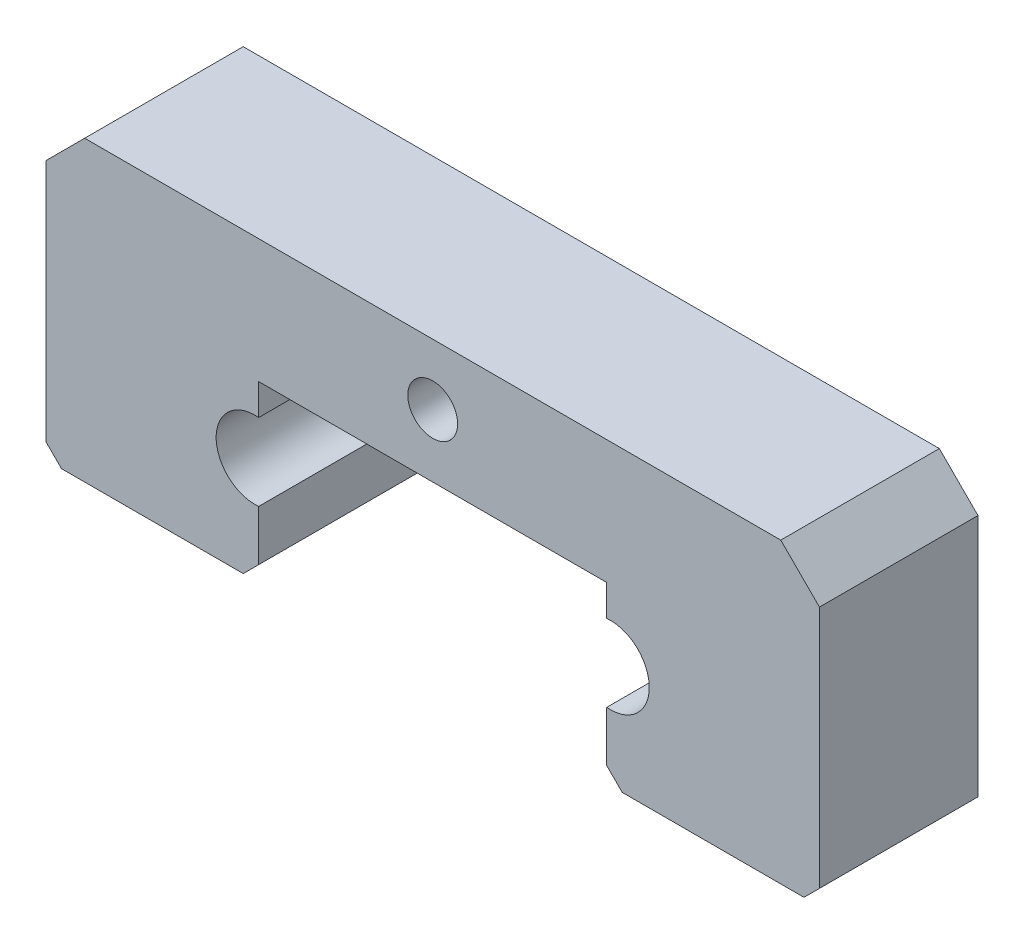
ISO-10303-21;
HEADER;
FILE_DESCRIPTION(('STEP AP214'),'2;1');
FILE_NAME('part.step','',(''),(''),'','','');
FILE_SCHEMA(('AUTOMOTIVE_DESIGN { 1 0 10303 214 1 1 1 1 }'));
ENDSEC;
DATA;
#1=APPLICATION_CONTEXT('core data for automotive mechanical design processes');
#2=APPLICATION_PROTOCOL_DEFINITION('international standard','automotive_design',2000,#1);
#3=PRODUCT_CONTEXT('',#1,'mechanical');
#4=PRODUCT('Part','Part','',(#3));
#5=PRODUCT_RELATED_PRODUCT_CATEGORY('part','',(#4));
#6=PRODUCT_DEFINITION_FORMATION('','',#4);
#7=PRODUCT_DEFINITION_CONTEXT('part definition',#1,'design');
#8=PRODUCT_DEFINITION('design','',#6,#7);
#9=PRODUCT_DEFINITION_SHAPE('','',#8);
#10=(LENGTH_UNIT() NAMED_UNIT(*) SI_UNIT(.MILLI.,.METRE.));
#11=(NAMED_UNIT(*) PLANE_ANGLE_UNIT() SI_UNIT($,.RADIAN.));
#12=(NAMED_UNIT(*) SI_UNIT($,.STERADIAN.) SOLID_ANGLE_UNIT());
#13=UNCERTAINTY_MEASURE_WITH_UNIT(LENGTH_MEASURE(1.E-05),#10,'distance_accuracy_value','');
#14=(GEOMETRIC_REPRESENTATION_CONTEXT(3) GLOBAL_UNCERTAINTY_ASSIGNED_CONTEXT((#13)) GLOBAL_UNIT_ASSIGNED_CONTEXT((#10,
#11,#12)) REPRESENTATION_CONTEXT('',''));
#15=CARTESIAN_POINT('',(0.,0.,0.));
#16=DIRECTION('',(0.,0.,1.));
#17=DIRECTION('',(1.,0.,0.));
#18=AXIS2_PLACEMENT_3D('',#15,#16,#17);
#19=CARTESIAN_POINT('',(10.,-3.6,19.05));
#20=DIRECTION('',(-0.707106781186548,0.707106781186548,0.));
#21=DIRECTION('',(0.,0.,1.));
#22=AXIS2_PLACEMENT_3D('',#19,#20,#21);
#23=PLANE('',#22);
#24=DIRECTION('',(0.707106781186548,0.707106781186548,0.));
#25=VECTOR('',#24,1.);
#26=CARTESIAN_POINT('',(9.6,-4.,19.05));
#27=LINE('',#26,#25);
#28=CARTESIAN_POINT('',(9.6,-4.,19.05));
#29=VERTEX_POINT('',#28);
#30=CARTESIAN_POINT('',(10.,-3.6,19.05));
#31=VERTEX_POINT('',#30);
#32=EDGE_CURVE('E317',#29,#31,#27,.T.);
#33=ORIENTED_EDGE('',*,*,#32,.F.);
#34=DIRECTION('',(0.,0.,1.));
#35=VECTOR('',#34,1.);
#36=CARTESIAN_POINT('',(9.6,-4.,14.95));
#37=LINE('',#36,#35);
#38=CARTESIAN_POINT('',(9.6,-4.,14.95));
#39=VERTEX_POINT('',#38);
#40=EDGE_CURVE('E247',#39,#29,#37,.T.);
#41=ORIENTED_EDGE('',*,*,#40,.F.);
#42=DIRECTION('',(-0.707106781186547,-0.707106781186548,0.));
#43=VECTOR('',#42,1.);
#44=CARTESIAN_POINT('',(10.,-3.6,14.95));
#45=LINE('',#44,#43);
#46=CARTESIAN_POINT('',(10.,-3.6,14.95));
#47=VERTEX_POINT('',#46);
#48=EDGE_CURVE('E261',#47,#39,#45,.T.);
#49=ORIENTED_EDGE('',*,*,#48,.F.);
#50=DIRECTION('',(0.,0.,-1.));
#51=VECTOR('',#50,1.);
#52=CARTESIAN_POINT('',(10.,-3.6,19.05));
#53=LINE('',#52,#51);
#54=EDGE_CURVE('E296',#31,#47,#53,.T.);
#55=ORIENTED_EDGE('',*,*,#54,.F.);
#56=EDGE_LOOP('',(#33,#41,#49,#55));
#57=FACE_BOUND('',#56,.T.);
#58=ADVANCED_FACE('F17',(#57),#23,.F.);
#59=CARTESIAN_POINT('',(4.9,-4.,19.05));
#60=DIRECTION('',(-0.707106781186548,-0.707106781186548,0.));
#61=DIRECTION('',(-0.707106781186548,0.707106781186548,0.));
#62=AXIS2_PLACEMENT_3D('',#59,#60,#61);
#63=PLANE('',#62);
#64=DIRECTION('',(0.707106781186547,-0.707106781186548,0.));
#65=VECTOR('',#64,1.);
#66=CARTESIAN_POINT('',(4.5,-3.6,19.05));
#67=LINE('',#66,#65);
#68=CARTESIAN_POINT('',(4.5,-3.6,19.05));
#69=VERTEX_POINT('',#68);
#70=CARTESIAN_POINT('',(4.9,-4.,19.05));
#71=VERTEX_POINT('',#70);
#72=EDGE_CURVE('E313',#69,#71,#67,.T.);
#73=ORIENTED_EDGE('',*,*,#72,.F.);
#74=DIRECTION('',(0.,0.,1.));
#75=VECTOR('',#74,1.);
#76=CARTESIAN_POINT('',(4.5,-3.6,14.95));
#77=LINE('',#76,#75);
#78=CARTESIAN_POINT('',(4.5,-3.6,14.95));
#79=VERTEX_POINT('',#78);
#80=EDGE_CURVE('E236',#79,#69,#77,.T.);
#81=ORIENTED_EDGE('',*,*,#80,.F.);
#82=DIRECTION('',(-0.707106781186548,0.707106781186548,0.));
#83=VECTOR('',#82,1.);
#84=CARTESIAN_POINT('',(4.9,-4.,14.95));
#85=LINE('',#84,#83);
#86=CARTESIAN_POINT('',(4.9,-4.,14.95));
#87=VERTEX_POINT('',#86);
#88=EDGE_CURVE('E28',#87,#79,#85,.T.);
#89=ORIENTED_EDGE('',*,*,#88,.F.);
#90=DIRECTION('',(0.,0.,-1.));
#91=VECTOR('',#90,1.);
#92=CARTESIAN_POINT('',(4.9,-4.,19.05));
#93=LINE('',#92,#91);
#94=EDGE_CURVE('E287',#71,#87,#93,.T.);
#95=ORIENTED_EDGE('',*,*,#94,.F.);
#96=EDGE_LOOP('',(#73,#81,#89,#95));
#97=FACE_BOUND('',#96,.T.);
#98=ADVANCED_FACE('F427',(#97),#63,.T.);
#99=CARTESIAN_POINT('',(-4.5,-3.6,19.05));
#100=DIRECTION('',(-0.707106781186548,0.707106781186548,0.));
#101=DIRECTION('',(0.,0.,1.));
#102=AXIS2_PLACEMENT_3D('',#99,#100,#101);
#103=PLANE('',#102);
#104=DIRECTION('',(0.707106781186547,0.707106781186548,0.));
#105=VECTOR('',#104,1.);
#106=CARTESIAN_POINT('',(-4.9,-4.,19.05));
#107=LINE('',#106,#105);
#108=CARTESIAN_POINT('',(-4.9,-4.,19.05));
#109=VERTEX_POINT('',#108);
#110=CARTESIAN_POINT('',(-4.5,-3.6,19.05));
#111=VERTEX_POINT('',#110);
#112=EDGE_CURVE('E294',#109,#111,#107,.T.);
#113=ORIENTED_EDGE('',*,*,#112,.F.);
#114=DIRECTION('',(0.,0.,1.));
#115=VECTOR('',#114,1.);
#116=CARTESIAN_POINT('',(-4.9,-4.,14.95));
#117=LINE('',#116,#115);
#118=CARTESIAN_POINT('',(-4.9,-4.,14.95));
#119=VERTEX_POINT('',#118);
#120=EDGE_CURVE('E233',#119,#109,#117,.T.);
#121=ORIENTED_EDGE('',*,*,#120,.F.);
#122=DIRECTION('',(-0.707106781186548,-0.707106781186548,0.));
#123=VECTOR('',#122,1.);
#124=CARTESIAN_POINT('',(-4.5,-3.6,14.95));
#125=LINE('',#124,#123);
#126=CARTESIAN_POINT('',(-4.5,-3.6,14.95));
#127=VERTEX_POINT('',#126);
#128=EDGE_CURVE('E11',#127,#119,#125,.T.);
#129=ORIENTED_EDGE('',*,*,#128,.F.);
#130=DIRECTION('',(0.,0.,-1.));
#131=VECTOR('',#130,1.);
#132=CARTESIAN_POINT('',(-4.5,-3.6,19.05));
#133=LINE('',#132,#131);
#134=EDGE_CURVE('E232',#111,#127,#133,.T.);
#135=ORIENTED_EDGE('',*,*,#134,.F.);
#136=EDGE_LOOP('',(#113,#121,#129,#135));
#137=FACE_BOUND('',#136,.T.);
#138=ADVANCED_FACE('F394',(#137),#103,.F.);
#139=CARTESIAN_POINT('',(-9.6,-4.,19.05));
#140=DIRECTION('',(-0.707106781186548,-0.707106781186548,0.));
#141=DIRECTION('',(-0.707106781186548,0.707106781186548,0.));
#142=AXIS2_PLACEMENT_3D('',#139,#140,#141);
#143=PLANE('',#142);
#144=DIRECTION('',(0.707106781186548,-0.707106781186548,0.));
#145=VECTOR('',#144,1.);
#146=CARTESIAN_POINT('',(-10.,-3.6,19.05));
#147=LINE('',#146,#145);
#148=CARTESIAN_POINT('',(-10.,-3.6,19.05));
#149=VERTEX_POINT('',#148);
#150=CARTESIAN_POINT('',(-9.6,-4.,19.05));
#151=VERTEX_POINT('',#150);
#152=EDGE_CURVE('E162',#149,#151,#147,.T.);
#153=ORIENTED_EDGE('',*,*,#152,.F.);
#154=DIRECTION('',(0.,0.,1.));
#155=VECTOR('',#154,1.);
#156=CARTESIAN_POINT('',(-10.,-3.6,14.95));
#157=LINE('',#156,#155);
#158=CARTESIAN_POINT('',(-10.,-3.6,14.95));
#159=VERTEX_POINT('',#158);
#160=EDGE_CURVE('E257',#159,#149,#157,.T.);
#161=ORIENTED_EDGE('',*,*,#160,.F.);
#162=DIRECTION('',(-0.707106781186547,0.707106781186549,0.));
#163=VECTOR('',#162,1.);
#164=CARTESIAN_POINT('',(-9.6,-4.,14.95));
#165=LINE('',#164,#163);
#166=CARTESIAN_POINT('',(-9.6,-4.,14.95));
#167=VERTEX_POINT('',#166);
#168=EDGE_CURVE('E266',#167,#159,#165,.T.);
#169=ORIENTED_EDGE('',*,*,#168,.F.);
#170=DIRECTION('',(0.,0.,-1.));
#171=VECTOR('',#170,1.);
#172=CARTESIAN_POINT('',(-9.6,-4.,19.05));
#173=LINE('',#172,#171);
#174=EDGE_CURVE('E244',#151,#167,#173,.T.);
#175=ORIENTED_EDGE('',*,*,#174,.F.);
#176=EDGE_LOOP('',(#153,#161,#169,#175));
#177=FACE_BOUND('',#176,.T.);
#178=ADVANCED_FACE('F19',(#177),#143,.T.);
#179=CARTESIAN_POINT('',(9.,3.7,19.05));
#180=DIRECTION('',(0.707106781186548,0.707106781186548,0.));
#181=DIRECTION('',(0.,0.,-1.));
#182=AXIS2_PLACEMENT_3D('',#179,#180,#181);
#183=PLANE('',#182);
#184=DIRECTION('',(-0.707106781186548,0.707106781186547,0.));
#185=VECTOR('',#184,1.);
#186=CARTESIAN_POINT('',(10.,2.7,19.05));
#187=LINE('',#186,#185);
#188=CARTESIAN_POINT('',(10.,2.7,19.05));
#189=VERTEX_POINT('',#188);
#190=CARTESIAN_POINT('',(9.,3.7,19.05));
#191=VERTEX_POINT('',#190);
#192=EDGE_CURVE('E374',#189,#191,#187,.T.);
#193=ORIENTED_EDGE('',*,*,#192,.F.);
#194=DIRECTION('',(0.,0.,1.));
#195=VECTOR('',#194,1.);
#196=CARTESIAN_POINT('',(10.,2.7,14.95));
#197=LINE('',#196,#195);
#198=CARTESIAN_POINT('',(10.,2.7,14.95));
#199=VERTEX_POINT('',#198);
#200=EDGE_CURVE('E345',#199,#189,#197,.T.);
#201=ORIENTED_EDGE('',*,*,#200,.F.);
#202=DIRECTION('',(0.707106781186548,-0.707106781186547,0.));
#203=VECTOR('',#202,1.);
#204=CARTESIAN_POINT('',(9.,3.7,14.95));
#205=LINE('',#204,#203);
#206=CARTESIAN_POINT('',(9.,3.7,14.95));
#207=VERTEX_POINT('',#206);
#208=EDGE_CURVE('E258',#207,#199,#205,.T.);
#209=ORIENTED_EDGE('',*,*,#208,.F.);
#210=DIRECTION('',(0.,0.,-1.));
#211=VECTOR('',#210,1.);
#212=CARTESIAN_POINT('',(9.,3.7,19.05));
#213=LINE('',#212,#211);
#214=EDGE_CURVE('E292',#191,#207,#213,.T.);
#215=ORIENTED_EDGE('',*,*,#214,.F.);
#216=EDGE_LOOP('',(#193,#201,#209,#215));
#217=FACE_BOUND('',#216,.T.);
#218=ADVANCED_FACE('F449',(#217),#183,.T.);
#219=CARTESIAN_POINT('',(-10.,2.7,19.05));
#220=DIRECTION('',(0.707106781186546,-0.707106781186549,0.));
#221=DIRECTION('',(0.,0.,-1.));
#222=AXIS2_PLACEMENT_3D('',#219,#220,#221);
#223=PLANE('',#222);
#224=DIRECTION('',(-0.707106781186549,-0.707106781186546,0.));
#225=VECTOR('',#224,1.);
#226=CARTESIAN_POINT('',(-9.,3.7,19.05));
#227=LINE('',#226,#225);
#228=CARTESIAN_POINT('',(-9.,3.7,19.05));
#229=VERTEX_POINT('',#228);
#230=CARTESIAN_POINT('',(-10.,2.7,19.05));
#231=VERTEX_POINT('',#230);
#232=EDGE_CURVE('E21',#229,#231,#227,.T.);
#233=ORIENTED_EDGE('',*,*,#232,.F.);
#234=DIRECTION('',(0.,0.,1.));
#235=VECTOR('',#234,1.);
#236=CARTESIAN_POINT('',(-9.,3.7,14.95));
#237=LINE('',#236,#235);
#238=CARTESIAN_POINT('',(-9.,3.7,14.95));
#239=VERTEX_POINT('',#238);
#240=EDGE_CURVE('E279',#239,#229,#237,.T.);
#241=ORIENTED_EDGE('',*,*,#240,.F.);
#242=DIRECTION('',(0.707106781186549,0.707106781186546,0.));
#243=VECTOR('',#242,1.);
#244=CARTESIAN_POINT('',(-10.,2.7,14.95));
#245=LINE('',#244,#243);
#246=CARTESIAN_POINT('',(-10.,2.7,14.95));
#247=VERTEX_POINT('',#246);
#248=EDGE_CURVE('E262',#247,#239,#245,.T.);
#249=ORIENTED_EDGE('',*,*,#248,.F.);
#250=DIRECTION('',(0.,0.,-1.));
#251=VECTOR('',#250,1.);
#252=CARTESIAN_POINT('',(-10.,2.7,19.05));
#253=LINE('',#252,#251);
#254=EDGE_CURVE('E245',#231,#247,#253,.T.);
#255=ORIENTED_EDGE('',*,*,#254,.F.);
#256=EDGE_LOOP('',(#233,#241,#249,#255));
#257=FACE_BOUND('',#256,.T.);
#258=ADVANCED_FACE('F655',(#257),#223,.F.);
#259=CARTESIAN_POINT('',(0.,0.,14.95));
#260=DIRECTION('',(0.,0.,1.));
#261=DIRECTION('',(1.,0.,0.));
#262=AXIS2_PLACEMENT_3D('',#259,#260,#261);
#263=PLANE('',#262);
#264=CARTESIAN_POINT('',(0.,2.12300290726788,14.95));
#265=DIRECTION('',(0.,0.,1.));
#266=DIRECTION('',(1.,0.,0.));
#267=AXIS2_PLACEMENT_3D('',#264,#265,#266);
#268=CIRCLE('',#267,0.644009461630724);
#269=CARTESIAN_POINT('',(0.644009461630724,2.12300290726788,14.95));
#270=VERTEX_POINT('',#269);
#271=EDGE_CURVE('E94',#270,#270,#268,.T.);
#272=ORIENTED_EDGE('',*,*,#271,.T.);
#273=EDGE_LOOP('',(#272));
#274=FACE_BOUND('',#273,.T.);
#275=DIRECTION('',(1.,0.,0.));
#276=VECTOR('',#275,1.);
#277=CARTESIAN_POINT('',(-9.6,-4.,14.95));
#278=LINE('',#277,#276);
#279=EDGE_CURVE('E331',#167,#119,#278,.T.);
#280=ORIENTED_EDGE('',*,*,#279,.F.);
#281=ORIENTED_EDGE('',*,*,#168,.T.);
#282=DIRECTION('',(0.,1.,0.));
#283=VECTOR('',#282,1.);
#284=CARTESIAN_POINT('',(-10.,-3.6,14.95));
#285=LINE('',#284,#283);
#286=EDGE_CURVE('E288',#159,#247,#285,.T.);
#287=ORIENTED_EDGE('',*,*,#286,.T.);
#288=ORIENTED_EDGE('',*,*,#248,.T.);
#289=DIRECTION('',(1.,0.,0.));
#290=VECTOR('',#289,1.);
#291=CARTESIAN_POINT('',(-9.,3.7,14.95));
#292=LINE('',#291,#290);
#293=EDGE_CURVE('E283',#239,#207,#292,.T.);
#294=ORIENTED_EDGE('',*,*,#293,.T.);
#295=ORIENTED_EDGE('',*,*,#208,.T.);
#296=DIRECTION('',(0.,1.,0.));
#297=VECTOR('',#296,1.);
#298=CARTESIAN_POINT('',(10.,-3.6,14.95));
#299=LINE('',#298,#297);
#300=EDGE_CURVE('E299',#47,#199,#299,.T.);
#301=ORIENTED_EDGE('',*,*,#300,.F.);
#302=ORIENTED_EDGE('',*,*,#48,.T.);
#303=DIRECTION('',(1.,0.,0.));
#304=VECTOR('',#303,1.);
#305=CARTESIAN_POINT('',(4.9,-4.,14.95));
#306=LINE('',#305,#304);
#307=EDGE_CURVE('E252',#87,#39,#306,.T.);
#308=ORIENTED_EDGE('',*,*,#307,.F.);
#309=ORIENTED_EDGE('',*,*,#88,.T.);
#310=DIRECTION('',(0.,1.,0.));
#311=VECTOR('',#310,1.);
#312=CARTESIAN_POINT('',(4.5,-3.6,14.95));
#313=LINE('',#312,#311);
#314=CARTESIAN_POINT('',(4.5,-2.29498743710662,14.95));
#315=VERTEX_POINT('',#314);
#316=EDGE_CURVE('E241',#79,#315,#313,.T.);
#317=ORIENTED_EDGE('',*,*,#316,.T.);
#318=CARTESIAN_POINT('',(4.6,-1.3,14.95));
#319=DIRECTION('',(0.,0.,1.));
#320=DIRECTION('',(1.,0.,0.));
#321=AXIS2_PLACEMENT_3D('',#318,#319,#320);
#322=CIRCLE('',#321,1.);
#323=CARTESIAN_POINT('',(4.5,-0.305012562893379,14.95));
#324=VERTEX_POINT('',#323);
#325=EDGE_CURVE('E211',#315,#324,#322,.T.);
#326=ORIENTED_EDGE('',*,*,#325,.T.);
#327=DIRECTION('',(0.,1.,0.));
#328=VECTOR('',#327,1.);
#329=CARTESIAN_POINT('',(4.5,-0.305012562893379,14.95));
#330=LINE('',#329,#328);
#331=CARTESIAN_POINT('',(4.5,0.5,14.95));
#332=VERTEX_POINT('',#331);
#333=EDGE_CURVE('E271',#324,#332,#330,.T.);
#334=ORIENTED_EDGE('',*,*,#333,.T.);
#335=DIRECTION('',(1.,0.,0.));
#336=VECTOR('',#335,1.);
#337=CARTESIAN_POINT('',(-4.5,0.5,14.95));
#338=LINE('',#337,#336);
#339=CARTESIAN_POINT('',(-4.5,0.5,14.95));
#340=VERTEX_POINT('',#339);
#341=EDGE_CURVE('E194',#340,#332,#338,.T.);
#342=ORIENTED_EDGE('',*,*,#341,.F.);
#343=DIRECTION('',(0.,1.,0.));
#344=VECTOR('',#343,1.);
#345=CARTESIAN_POINT('',(-4.5,-0.30501256289338,14.95));
#346=LINE('',#345,#344);
#347=CARTESIAN_POINT('',(-4.5,-0.30501256289338,14.95));
#348=VERTEX_POINT('',#347);
#349=EDGE_CURVE('E185',#348,#340,#346,.T.);
#350=ORIENTED_EDGE('',*,*,#349,.F.);
#351=CARTESIAN_POINT('',(-4.6,-1.3,14.95));
#352=DIRECTION('',(0.,0.,1.));
#353=DIRECTION('',(1.,0.,0.));
#354=AXIS2_PLACEMENT_3D('',#351,#352,#353);
#355=CIRCLE('',#354,1.);
#356=CARTESIAN_POINT('',(-4.5,-2.29498743710662,14.95));
#357=VERTEX_POINT('',#356);
#358=EDGE_CURVE('E191',#348,#357,#355,.T.);
#359=ORIENTED_EDGE('',*,*,#358,.T.);
#360=DIRECTION('',(0.,1.,0.));
#361=VECTOR('',#360,1.);
#362=CARTESIAN_POINT('',(-4.5,-3.6,14.95));
#363=LINE('',#362,#361);
#364=EDGE_CURVE('E200',#127,#357,#363,.T.);
#365=ORIENTED_EDGE('',*,*,#364,.F.);
#366=ORIENTED_EDGE('',*,*,#128,.T.);
#367=EDGE_LOOP('',(#280,#281,#287,#288,#294,#295,#301,#302,#308,#309,#317,#326,#334,#342,#350,
#359,#365,#366));
#368=FACE_BOUND('',#367,.T.);
#369=ADVANCED_FACE('F188',(#274,#368),#263,.F.);
#370=CARTESIAN_POINT('',(0.,0.,19.05));
#371=DIRECTION('',(0.,0.,1.));
#372=DIRECTION('',(1.,0.,0.));
#373=AXIS2_PLACEMENT_3D('',#370,#371,#372);
#374=PLANE('',#373);
#375=CARTESIAN_POINT('',(0.,2.12300290726788,19.05));
#376=DIRECTION('',(0.,0.,1.));
#377=DIRECTION('',(1.,0.,0.));
#378=AXIS2_PLACEMENT_3D('',#375,#376,#377);
#379=CIRCLE('',#378,0.644009461630724);
#380=CARTESIAN_POINT('',(0.644009461630724,2.12300290726788,19.05));
#381=VERTEX_POINT('',#380);
#382=EDGE_CURVE('E326',#381,#381,#379,.T.);
#383=ORIENTED_EDGE('',*,*,#382,.F.);
#384=EDGE_LOOP('',(#383));
#385=FACE_BOUND('',#384,.T.);
#386=DIRECTION('',(0.,1.,0.));
#387=VECTOR('',#386,1.);
#388=CARTESIAN_POINT('',(-10.,-3.6,19.05));
#389=LINE('',#388,#387);
#390=EDGE_CURVE('E253',#149,#231,#389,.T.);
#391=ORIENTED_EDGE('',*,*,#390,.F.);
#392=ORIENTED_EDGE('',*,*,#152,.T.);
#393=DIRECTION('',(1.,0.,0.));
#394=VECTOR('',#393,1.);
#395=CARTESIAN_POINT('',(-9.6,-4.,19.05));
#396=LINE('',#395,#394);
#397=EDGE_CURVE('E242',#151,#109,#396,.T.);
#398=ORIENTED_EDGE('',*,*,#397,.T.);
#399=ORIENTED_EDGE('',*,*,#112,.T.);
#400=DIRECTION('',(0.,1.,0.));
#401=VECTOR('',#400,1.);
#402=CARTESIAN_POINT('',(-4.5,-3.6,19.05));
#403=LINE('',#402,#401);
#404=CARTESIAN_POINT('',(-4.5,-2.29498743710662,19.05));
#405=VERTEX_POINT('',#404);
#406=EDGE_CURVE('E228',#111,#405,#403,.T.);
#407=ORIENTED_EDGE('',*,*,#406,.T.);
#408=CARTESIAN_POINT('',(-4.6,-1.3,19.05));
#409=DIRECTION('',(0.,0.,1.));
#410=DIRECTION('',(1.,0.,0.));
#411=AXIS2_PLACEMENT_3D('',#408,#409,#410);
#412=CIRCLE('',#411,1.);
#413=CARTESIAN_POINT('',(-4.5,-0.30501256289338,19.05));
#414=VERTEX_POINT('',#413);
#415=EDGE_CURVE('E222',#414,#405,#412,.T.);
#416=ORIENTED_EDGE('',*,*,#415,.F.);
#417=DIRECTION('',(0.,1.,0.));
#418=VECTOR('',#417,1.);
#419=CARTESIAN_POINT('',(-4.5,-0.30501256289338,19.05));
#420=LINE('',#419,#418);
#421=CARTESIAN_POINT('',(-4.5,0.5,19.05));
#422=VERTEX_POINT('',#421);
#423=EDGE_CURVE('E206',#414,#422,#420,.T.);
#424=ORIENTED_EDGE('',*,*,#423,.T.);
#425=DIRECTION('',(1.,0.,0.));
#426=VECTOR('',#425,1.);
#427=CARTESIAN_POINT('',(-4.5,0.5,19.05));
#428=LINE('',#427,#426);
#429=CARTESIAN_POINT('',(4.5,0.5,19.05));
#430=VERTEX_POINT('',#429);
#431=EDGE_CURVE('E270',#422,#430,#428,.T.);
#432=ORIENTED_EDGE('',*,*,#431,.T.);
#433=DIRECTION('',(0.,1.,0.));
#434=VECTOR('',#433,1.);
#435=CARTESIAN_POINT('',(4.5,-0.305012562893379,19.05));
#436=LINE('',#435,#434);
#437=CARTESIAN_POINT('',(4.5,-0.305012562893379,19.05));
#438=VERTEX_POINT('',#437);
#439=EDGE_CURVE('E42',#438,#430,#436,.T.);
#440=ORIENTED_EDGE('',*,*,#439,.F.);
#441=CARTESIAN_POINT('',(4.6,-1.3,19.05));
#442=DIRECTION('',(0.,0.,1.));
#443=DIRECTION('',(1.,0.,0.));
#444=AXIS2_PLACEMENT_3D('',#441,#442,#443);
#445=CIRCLE('',#444,1.);
#446=CARTESIAN_POINT('',(4.5,-2.29498743710662,19.05));
#447=VERTEX_POINT('',#446);
#448=EDGE_CURVE('E318',#447,#438,#445,.T.);
#449=ORIENTED_EDGE('',*,*,#448,.F.);
#450=DIRECTION('',(0.,1.,0.));
#451=VECTOR('',#450,1.);
#452=CARTESIAN_POINT('',(4.5,-3.6,19.05));
#453=LINE('',#452,#451);
#454=EDGE_CURVE('E240',#69,#447,#453,.T.);
#455=ORIENTED_EDGE('',*,*,#454,.F.);
#456=ORIENTED_EDGE('',*,*,#72,.T.);
#457=DIRECTION('',(1.,0.,0.));
#458=VECTOR('',#457,1.);
#459=CARTESIAN_POINT('',(4.9,-4.,19.05));
#460=LINE('',#459,#458);
#461=EDGE_CURVE('E380',#71,#29,#460,.T.);
#462=ORIENTED_EDGE('',*,*,#461,.T.);
#463=ORIENTED_EDGE('',*,*,#32,.T.);
#464=DIRECTION('',(0.,1.,0.));
#465=VECTOR('',#464,1.);
#466=CARTESIAN_POINT('',(10.,-3.6,19.05));
#467=LINE('',#466,#465);
#468=EDGE_CURVE('E251',#31,#189,#467,.T.);
#469=ORIENTED_EDGE('',*,*,#468,.T.);
#470=ORIENTED_EDGE('',*,*,#192,.T.);
#471=DIRECTION('',(1.,0.,0.));
#472=VECTOR('',#471,1.);
#473=CARTESIAN_POINT('',(-9.,3.7,19.05));
#474=LINE('',#473,#472);
#475=EDGE_CURVE('E226',#229,#191,#474,.T.);
#476=ORIENTED_EDGE('',*,*,#475,.F.);
#477=ORIENTED_EDGE('',*,*,#232,.T.);
#478=EDGE_LOOP('',(#391,#392,#398,#399,#407,#416,#424,#432,#440,#449,#455,#456,#462,#463,#469,
#470,#476,#477));
#479=FACE_BOUND('',#478,.T.);
#480=ADVANCED_FACE('F390',(#385,#479),#374,.T.);
#481=CARTESIAN_POINT('',(4.5,0.,19.05));
#482=DIRECTION('',(-1.,0.,0.));
#483=DIRECTION('',(0.,1.,0.));
#484=AXIS2_PLACEMENT_3D('',#481,#482,#483);
#485=PLANE('',#484);
#486=ORIENTED_EDGE('',*,*,#333,.F.);
#487=DIRECTION('',(0.,0.,-1.));
#488=VECTOR('',#487,1.);
#489=CARTESIAN_POINT('',(4.5,-0.305012562893379,19.05));
#490=LINE('',#489,#488);
#491=EDGE_CURVE('E322',#438,#324,#490,.T.);
#492=ORIENTED_EDGE('',*,*,#491,.F.);
#493=ORIENTED_EDGE('',*,*,#439,.T.);
#494=DIRECTION('',(0.,0.,-1.));
#495=VECTOR('',#494,1.);
#496=CARTESIAN_POINT('',(4.5,0.5,19.05));
#497=LINE('',#496,#495);
#498=EDGE_CURVE('E267',#430,#332,#497,.T.);
#499=ORIENTED_EDGE('',*,*,#498,.T.);
#500=EDGE_LOOP('',(#486,#492,#493,#499));
#501=FACE_BOUND('',#500,.T.);
#502=ADVANCED_FACE('F403',(#501),#485,.T.);
#503=CARTESIAN_POINT('',(0.,0.5,19.05));
#504=DIRECTION('',(0.,1.,0.));
#505=DIRECTION('',(1.,0.,0.));
#506=AXIS2_PLACEMENT_3D('',#503,#504,#505);
#507=PLANE('',#506);
#508=ORIENTED_EDGE('',*,*,#341,.T.);
#509=ORIENTED_EDGE('',*,*,#498,.F.);
#510=ORIENTED_EDGE('',*,*,#431,.F.);
#511=DIRECTION('',(0.,0.,-1.));
#512=VECTOR('',#511,1.);
#513=CARTESIAN_POINT('',(-4.5,0.5,19.05));
#514=LINE('',#513,#512);
#515=EDGE_CURVE('E199',#422,#340,#514,.T.);
#516=ORIENTED_EDGE('',*,*,#515,.T.);
#517=EDGE_LOOP('',(#508,#509,#510,#516));
#518=FACE_BOUND('',#517,.T.);
#519=ADVANCED_FACE('F402',(#518),#507,.F.);
#520=CARTESIAN_POINT('',(-4.5,0.,19.05));
#521=DIRECTION('',(-1.,0.,0.));
#522=DIRECTION('',(0.,1.,0.));
#523=AXIS2_PLACEMENT_3D('',#520,#521,#522);
#524=PLANE('',#523);
#525=ORIENTED_EDGE('',*,*,#349,.T.);
#526=ORIENTED_EDGE('',*,*,#515,.F.);
#527=ORIENTED_EDGE('',*,*,#423,.F.);
#528=DIRECTION('',(0.,0.,-1.));
#529=VECTOR('',#528,1.);
#530=CARTESIAN_POINT('',(-4.5,-0.30501256289338,19.05));
#531=LINE('',#530,#529);
#532=EDGE_CURVE('E203',#414,#348,#531,.T.);
#533=ORIENTED_EDGE('',*,*,#532,.T.);
#534=EDGE_LOOP('',(#525,#526,#527,#533));
#535=FACE_BOUND('',#534,.T.);
#536=ADVANCED_FACE('F204',(#535),#524,.F.);
#537=CARTESIAN_POINT('',(-4.5,0.,19.05));
#538=DIRECTION('',(-1.,0.,0.));
#539=DIRECTION('',(0.,0.,1.));
#540=AXIS2_PLACEMENT_3D('',#537,#538,#539);
#541=PLANE('',#540);
#542=ORIENTED_EDGE('',*,*,#406,.F.);
#543=ORIENTED_EDGE('',*,*,#134,.T.);
#544=ORIENTED_EDGE('',*,*,#364,.T.);
#545=DIRECTION('',(0.,0.,-1.));
#546=VECTOR('',#545,1.);
#547=CARTESIAN_POINT('',(-4.5,-2.29498743710662,19.05));
#548=LINE('',#547,#546);
#549=EDGE_CURVE('E215',#405,#357,#548,.T.);
#550=ORIENTED_EDGE('',*,*,#549,.F.);
#551=EDGE_LOOP('',(#542,#543,#544,#550));
#552=FACE_BOUND('',#551,.T.);
#553=ADVANCED_FACE('F395',(#552),#541,.F.);
#554=CARTESIAN_POINT('',(0.,-4.,19.05));
#555=DIRECTION('',(0.,1.,0.));
#556=DIRECTION('',(1.,0.,0.));
#557=AXIS2_PLACEMENT_3D('',#554,#555,#556);
#558=PLANE('',#557);
#559=ORIENTED_EDGE('',*,*,#397,.F.);
#560=ORIENTED_EDGE('',*,*,#174,.T.);
#561=ORIENTED_EDGE('',*,*,#279,.T.);
#562=ORIENTED_EDGE('',*,*,#120,.T.);
#563=EDGE_LOOP('',(#559,#560,#561,#562));
#564=FACE_BOUND('',#563,.T.);
#565=ADVANCED_FACE('F668',(#564),#558,.F.);
#566=CARTESIAN_POINT('',(-10.,0.,19.05));
#567=DIRECTION('',(-1.,0.,0.));
#568=DIRECTION('',(0.,1.,0.));
#569=AXIS2_PLACEMENT_3D('',#566,#567,#568);
#570=PLANE('',#569);
#571=ORIENTED_EDGE('',*,*,#286,.F.);
#572=ORIENTED_EDGE('',*,*,#160,.T.);
#573=ORIENTED_EDGE('',*,*,#390,.T.);
#574=ORIENTED_EDGE('',*,*,#254,.T.);
#575=EDGE_LOOP('',(#571,#572,#573,#574));
#576=FACE_BOUND('',#575,.T.);
#577=ADVANCED_FACE('F663',(#576),#570,.T.);
#578=CARTESIAN_POINT('',(0.,3.7,19.05));
#579=DIRECTION('',(0.,1.,0.));
#580=DIRECTION('',(0.,0.,-1.));
#581=AXIS2_PLACEMENT_3D('',#578,#579,#580);
#582=PLANE('',#581);
#583=ORIENTED_EDGE('',*,*,#293,.F.);
#584=ORIENTED_EDGE('',*,*,#240,.T.);
#585=ORIENTED_EDGE('',*,*,#475,.T.);
#586=ORIENTED_EDGE('',*,*,#214,.T.);
#587=EDGE_LOOP('',(#583,#584,#585,#586));
#588=FACE_BOUND('',#587,.T.);
#589=ADVANCED_FACE('F452',(#588),#582,.T.);
#590=CARTESIAN_POINT('',(10.,0.,19.05));
#591=DIRECTION('',(-1.,0.,0.));
#592=DIRECTION('',(0.,0.,1.));
#593=AXIS2_PLACEMENT_3D('',#590,#591,#592);
#594=PLANE('',#593);
#595=ORIENTED_EDGE('',*,*,#468,.F.);
#596=ORIENTED_EDGE('',*,*,#54,.T.);
#597=ORIENTED_EDGE('',*,*,#300,.T.);
#598=ORIENTED_EDGE('',*,*,#200,.T.);
#599=EDGE_LOOP('',(#595,#596,#597,#598));
#600=FACE_BOUND('',#599,.T.);
#601=ADVANCED_FACE('F440',(#600),#594,.F.);
#602=CARTESIAN_POINT('',(0.,-4.,19.05));
#603=DIRECTION('',(0.,1.,0.));
#604=DIRECTION('',(1.,0.,0.));
#605=AXIS2_PLACEMENT_3D('',#602,#603,#604);
#606=PLANE('',#605);
#607=ORIENTED_EDGE('',*,*,#461,.F.);
#608=ORIENTED_EDGE('',*,*,#94,.T.);
#609=ORIENTED_EDGE('',*,*,#307,.T.);
#610=ORIENTED_EDGE('',*,*,#40,.T.);
#611=EDGE_LOOP('',(#607,#608,#609,#610));
#612=FACE_BOUND('',#611,.T.);
#613=ADVANCED_FACE('F431',(#612),#606,.F.);
#614=CARTESIAN_POINT('',(4.5,0.,19.05));
#615=DIRECTION('',(-1.,0.,0.));
#616=DIRECTION('',(0.,0.,1.));
#617=AXIS2_PLACEMENT_3D('',#614,#615,#616);
#618=PLANE('',#617);
#619=ORIENTED_EDGE('',*,*,#316,.F.);
#620=ORIENTED_EDGE('',*,*,#80,.T.);
#621=ORIENTED_EDGE('',*,*,#454,.T.);
#622=DIRECTION('',(0.,0.,-1.));
#623=VECTOR('',#622,1.);
#624=CARTESIAN_POINT('',(4.5,-2.29498743710662,19.05));
#625=LINE('',#624,#623);
#626=EDGE_CURVE('E323',#447,#315,#625,.T.);
#627=ORIENTED_EDGE('',*,*,#626,.T.);
#628=EDGE_LOOP('',(#619,#620,#621,#627));
#629=FACE_BOUND('',#628,.T.);
#630=ADVANCED_FACE('F414',(#629),#618,.T.);
#631=CARTESIAN_POINT('',(4.6,-1.3,19.05));
#632=DIRECTION('',(0.,0.,-1.));
#633=DIRECTION('',(1.,0.,0.));
#634=AXIS2_PLACEMENT_3D('',#631,#632,#633);
#635=CYLINDRICAL_SURFACE('',#634,1.);
#636=ORIENTED_EDGE('',*,*,#325,.F.);
#637=ORIENTED_EDGE('',*,*,#626,.F.);
#638=ORIENTED_EDGE('',*,*,#448,.T.);
#639=ORIENTED_EDGE('',*,*,#491,.T.);
#640=EDGE_LOOP('',(#636,#637,#638,#639));
#641=FACE_BOUND('',#640,.T.);
#642=ADVANCED_FACE('F406',(#641),#635,.F.);
#643=CARTESIAN_POINT('',(-4.6,-1.3,19.05));
#644=DIRECTION('',(0.,0.,-1.));
#645=DIRECTION('',(-1.,0.,0.));
#646=AXIS2_PLACEMENT_3D('',#643,#644,#645);
#647=CYLINDRICAL_SURFACE('',#646,1.);
#648=ORIENTED_EDGE('',*,*,#415,.T.);
#649=ORIENTED_EDGE('',*,*,#549,.T.);
#650=ORIENTED_EDGE('',*,*,#358,.F.);
#651=ORIENTED_EDGE('',*,*,#532,.F.);
#652=EDGE_LOOP('',(#648,#649,#650,#651));
#653=FACE_BOUND('',#652,.T.);
#654=ADVANCED_FACE('F213',(#653),#647,.F.);
#655=CARTESIAN_POINT('',(0.,2.12300290726788,19.05));
#656=DIRECTION('',(0.,0.,-1.));
#657=DIRECTION('',(-1.,0.,0.));
#658=AXIS2_PLACEMENT_3D('',#655,#656,#657);
#659=CYLINDRICAL_SURFACE('',#658,0.644009461630724);
#660=ORIENTED_EDGE('',*,*,#382,.T.);
#661=DIRECTION('',(0.,0.,-1.));
#662=VECTOR('',#661,1.);
#663=CARTESIAN_POINT('',(0.644009461630724,2.12300290726788,19.05));
#664=LINE('',#663,#662);
#665=EDGE_CURVE('E108',#381,#270,#664,.T.);
#666=ORIENTED_EDGE('',*,*,#665,.T.);
#667=ORIENTED_EDGE('',*,*,#271,.F.);
#668=ORIENTED_EDGE('',*,*,#665,.F.);
#669=EDGE_LOOP('',(#660,#666,#667,#668));
#670=FACE_BOUND('',#669,.T.);
#671=ADVANCED_FACE('F631',(#670),#659,.F.);
#672=CLOSED_SHELL('',(#58,#98,#138,#178,#218,#258,#369,#480,#502,#519,#536,#553,#565,#577,#589,
#601,#613,#630,#642,#654,#671));
#673=MANIFOLD_SOLID_BREP('B1',#672);
#674=ADVANCED_BREP_SHAPE_REPRESENTATION('',(#18,#673),#14);
#675=SHAPE_DEFINITION_REPRESENTATION(#9,#674);
ENDSEC;
END-ISO-10303-21;
